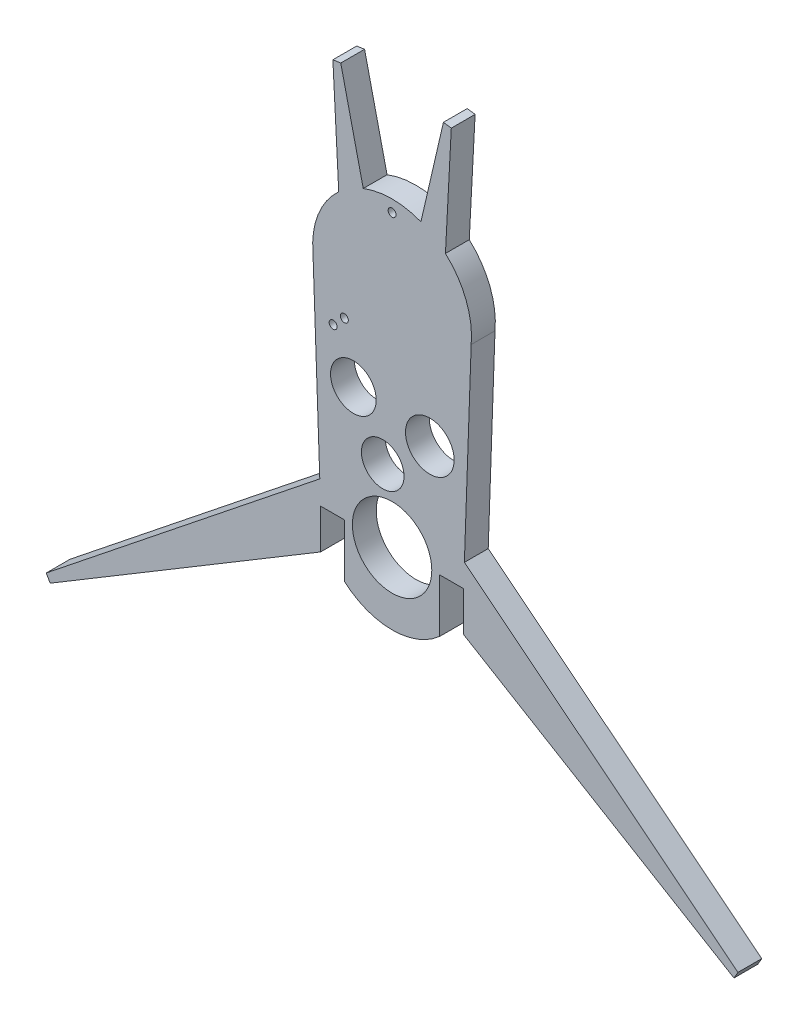
ISO-10303-21;
HEADER;
FILE_DESCRIPTION(('STEP AP214'),'2;1');
FILE_NAME('part.step','',(''),(''),'','','');
FILE_SCHEMA(('AUTOMOTIVE_DESIGN { 1 0 10303 214 1 1 1 1 }'));
ENDSEC;
DATA;
#1=APPLICATION_CONTEXT('core data for automotive mechanical design processes');
#2=APPLICATION_PROTOCOL_DEFINITION('international standard','automotive_design',2000,#1);
#3=PRODUCT_CONTEXT('',#1,'mechanical');
#4=PRODUCT('Part','Part','',(#3));
#5=PRODUCT_RELATED_PRODUCT_CATEGORY('part','',(#4));
#6=PRODUCT_DEFINITION_FORMATION('','',#4);
#7=PRODUCT_DEFINITION_CONTEXT('part definition',#1,'design');
#8=PRODUCT_DEFINITION('design','',#6,#7);
#9=PRODUCT_DEFINITION_SHAPE('','',#8);
#10=(LENGTH_UNIT() NAMED_UNIT(*) SI_UNIT(.MILLI.,.METRE.));
#11=(NAMED_UNIT(*) PLANE_ANGLE_UNIT() SI_UNIT($,.RADIAN.));
#12=(NAMED_UNIT(*) SI_UNIT($,.STERADIAN.) SOLID_ANGLE_UNIT());
#13=UNCERTAINTY_MEASURE_WITH_UNIT(LENGTH_MEASURE(1.E-05),#10,'distance_accuracy_value','');
#14=(GEOMETRIC_REPRESENTATION_CONTEXT(3) GLOBAL_UNCERTAINTY_ASSIGNED_CONTEXT((#13)) GLOBAL_UNIT_ASSIGNED_CONTEXT((#10,
#11,#12)) REPRESENTATION_CONTEXT('',''));
#15=CARTESIAN_POINT('',(0.,0.,0.));
#16=DIRECTION('',(0.,0.,1.));
#17=DIRECTION('',(1.,0.,0.));
#18=AXIS2_PLACEMENT_3D('',#15,#16,#17);
#19=CARTESIAN_POINT('',(0.,28.,3.));
#20=DIRECTION('',(0.,0.,-1.));
#21=DIRECTION('',(-1.,0.,0.));
#22=AXIS2_PLACEMENT_3D('',#19,#20,#21);
#23=CYLINDRICAL_SURFACE('',#22,10.);
#24=CARTESIAN_POINT('',(0.,28.,0.));
#25=DIRECTION('',(0.,0.,1.));
#26=DIRECTION('',(-1.,0.,0.));
#27=AXIS2_PLACEMENT_3D('',#24,#25,#26);
#28=CIRCLE('',#27,10.);
#29=CARTESIAN_POINT('',(3.63174307168968,37.3172121507044,0.));
#30=VERTEX_POINT('',#29);
#31=CARTESIAN_POINT('',(-3.63174307168968,37.3172121507044,0.));
#32=VERTEX_POINT('',#31);
#33=EDGE_CURVE('E220',#30,#32,#28,.T.);
#34=ORIENTED_EDGE('',*,*,#33,.T.);
#35=DIRECTION('',(0.,0.,1.));
#36=VECTOR('',#35,1.);
#37=CARTESIAN_POINT('',(-3.63174307168968,37.3172121507044,0.));
#38=LINE('',#37,#36);
#39=CARTESIAN_POINT('',(-3.63174307168968,37.3172121507044,3.));
#40=VERTEX_POINT('',#39);
#41=EDGE_CURVE('E207',#32,#40,#38,.T.);
#42=ORIENTED_EDGE('',*,*,#41,.T.);
#43=CARTESIAN_POINT('',(0.,28.,3.));
#44=DIRECTION('',(0.,0.,1.));
#45=DIRECTION('',(-1.,0.,0.));
#46=AXIS2_PLACEMENT_3D('',#43,#44,#45);
#47=CIRCLE('',#46,10.);
#48=CARTESIAN_POINT('',(3.63174307168965,37.3172121507044,3.));
#49=VERTEX_POINT('',#48);
#50=EDGE_CURVE('E218',#49,#40,#47,.T.);
#51=ORIENTED_EDGE('',*,*,#50,.F.);
#52=DIRECTION('',(0.,0.,1.));
#53=VECTOR('',#52,1.);
#54=CARTESIAN_POINT('',(3.63174307168968,37.3172121507044,0.));
#55=LINE('',#54,#53);
#56=EDGE_CURVE('E211',#30,#49,#55,.T.);
#57=ORIENTED_EDGE('',*,*,#56,.F.);
#58=EDGE_LOOP('',(#34,#42,#51,#57));
#59=FACE_BOUND('',#58,.T.);
#60=ADVANCED_FACE('F41',(#59),#23,.T.);
#61=CARTESIAN_POINT('',(-6.71816014535384,35.4071805878741,3.));
#62=VERTEX_POINT('',#61);
#63=CARTESIAN_POINT('',(-9.95907170702906,27.0961799215256,3.));
#64=VERTEX_POINT('',#63);
#65=EDGE_CURVE('E226',#62,#64,#47,.T.);
#66=ORIENTED_EDGE('',*,*,#65,.F.);
#67=DIRECTION('',(0.,0.,1.));
#68=VECTOR('',#67,1.);
#69=CARTESIAN_POINT('',(-6.71816014535384,35.4071805878741,0.));
#70=LINE('',#69,#68);
#71=CARTESIAN_POINT('',(-6.71816014535384,35.4071805878741,0.));
#72=VERTEX_POINT('',#71);
#73=EDGE_CURVE('E221',#72,#62,#70,.T.);
#74=ORIENTED_EDGE('',*,*,#73,.F.);
#75=CARTESIAN_POINT('',(-9.95907170702906,27.0961799215256,0.));
#76=VERTEX_POINT('',#75);
#77=EDGE_CURVE('E255',#72,#76,#28,.T.);
#78=ORIENTED_EDGE('',*,*,#77,.T.);
#79=DIRECTION('',(0.,0.,-1.));
#80=VECTOR('',#79,1.);
#81=CARTESIAN_POINT('',(-9.95907170702906,27.0961799215256,3.));
#82=LINE('',#81,#80);
#83=EDGE_CURVE('E289',#64,#76,#82,.T.);
#84=ORIENTED_EDGE('',*,*,#83,.F.);
#85=EDGE_LOOP('',(#66,#74,#78,#84));
#86=FACE_BOUND('',#85,.T.);
#87=ADVANCED_FACE('F399',(#86),#23,.T.);
#88=CARTESIAN_POINT('',(0.,28.,3.));
#89=DIRECTION('',(0.,0.,-1.));
#90=DIRECTION('',(-1.,0.,0.));
#91=AXIS2_PLACEMENT_3D('',#88,#89,#90);
#92=PLANE('',#91);
#93=ORIENTED_EDGE('',*,*,#50,.T.);
#94=DIRECTION('',(-0.224951054343858,0.974370064785237,0.));
#95=VECTOR('',#94,1.);
#96=CARTESIAN_POINT('',(-3.63174307168968,37.3172121507044,3.));
#97=LINE('',#96,#95);
#98=CARTESIAN_POINT('',(-6.46352101363214,49.5829899875586,3.));
#99=VERTEX_POINT('',#98);
#100=EDGE_CURVE('E203',#40,#99,#97,.T.);
#101=ORIENTED_EDGE('',*,*,#100,.T.);
#102=DIRECTION('',(-0.990268068741571,-0.139173100960059,0.));
#103=VECTOR('',#102,1.);
#104=CARTESIAN_POINT('',(-6.46352101363214,49.5829899875586,3.));
#105=LINE('',#104,#103);
#106=CARTESIAN_POINT('',(-7.45378908237371,49.4438168865985,3.));
#107=VERTEX_POINT('',#106);
#108=EDGE_CURVE('E212',#99,#107,#105,.T.);
#109=ORIENTED_EDGE('',*,*,#108,.T.);
#110=DIRECTION('',(0.0523359562429436,-0.998629534754574,0.));
#111=VECTOR('',#110,1.);
#112=CARTESIAN_POINT('',(-7.45378908237371,49.4438168865985,3.));
#113=LINE('',#112,#111);
#114=EDGE_CURVE('E56',#107,#62,#113,.T.);
#115=ORIENTED_EDGE('',*,*,#114,.T.);
#116=ORIENTED_EDGE('',*,*,#65,.T.);
#117=DIRECTION('',(0.0353729383723889,-0.999374181791236,0.));
#118=VECTOR('',#117,1.);
#119=CARTESIAN_POINT('',(-9.,0.,3.));
#120=LINE('',#119,#118);
#121=CARTESIAN_POINT('',(-9.1032688798853,2.91760473086458,3.));
#122=VERTEX_POINT('',#121);
#123=EDGE_CURVE('E229',#64,#122,#120,.T.);
#124=ORIENTED_EDGE('',*,*,#123,.T.);
#125=DIRECTION('',(-0.781679862279824,-0.623679880151826,0.));
#126=VECTOR('',#125,1.);
#127=CARTESIAN_POINT('',(-43.5491050715832,-24.5657372668561,3.));
#128=LINE('',#127,#126);
#129=CARTESIAN_POINT('',(-43.5491050715832,-24.5657372668561,3.));
#130=VERTEX_POINT('',#129);
#131=EDGE_CURVE('E461',#122,#130,#128,.T.);
#132=ORIENTED_EDGE('',*,*,#131,.T.);
#133=DIRECTION('',(0.499999999999997,-0.86602540378444,0.));
#134=VECTOR('',#133,1.);
#135=CARTESIAN_POINT('',(-43.0491050715832,-25.4317626706406,3.));
#136=LINE('',#135,#134);
#137=CARTESIAN_POINT('',(-43.0491050715832,-25.4317626706406,3.));
#138=VERTEX_POINT('',#137);
#139=EDGE_CURVE('E465',#130,#138,#136,.T.);
#140=ORIENTED_EDGE('',*,*,#139,.T.);
#141=DIRECTION('',(0.857467375192334,0.514538337231318,0.));
#142=VECTOR('',#141,1.);
#143=CARTESIAN_POINT('',(-9.,-5.,3.));
#144=LINE('',#143,#142);
#145=CARTESIAN_POINT('',(-9.,-5.,3.));
#146=VERTEX_POINT('',#145);
#147=EDGE_CURVE('E459',#138,#146,#144,.T.);
#148=ORIENTED_EDGE('',*,*,#147,.T.);
#149=DIRECTION('',(0.,1.,0.));
#150=VECTOR('',#149,1.);
#151=CARTESIAN_POINT('',(-9.,-5.,3.));
#152=LINE('',#151,#150);
#153=CARTESIAN_POINT('',(-9.,0.,3.));
#154=VERTEX_POINT('',#153);
#155=EDGE_CURVE('E456',#146,#154,#152,.T.);
#156=ORIENTED_EDGE('',*,*,#155,.T.);
#157=DIRECTION('',(1.,0.,0.));
#158=VECTOR('',#157,1.);
#159=CARTESIAN_POINT('',(-6.,0.,3.));
#160=LINE('',#159,#158);
#161=CARTESIAN_POINT('',(-6.,0.,3.));
#162=VERTEX_POINT('',#161);
#163=EDGE_CURVE('E237',#154,#162,#160,.T.);
#164=ORIENTED_EDGE('',*,*,#163,.T.);
#165=DIRECTION('',(0.,-1.,0.));
#166=VECTOR('',#165,1.);
#167=CARTESIAN_POINT('',(-6.,-6.70820393249937,3.));
#168=LINE('',#167,#166);
#169=CARTESIAN_POINT('',(-6.,-6.70820393249937,3.));
#170=VERTEX_POINT('',#169);
#171=EDGE_CURVE('E239',#162,#170,#168,.T.);
#172=ORIENTED_EDGE('',*,*,#171,.T.);
#173=CARTESIAN_POINT('',(0.,0.,3.));
#174=DIRECTION('',(0.,0.,1.));
#175=DIRECTION('',(1.,0.,0.));
#176=AXIS2_PLACEMENT_3D('',#173,#174,#175);
#177=CIRCLE('',#176,9.);
#178=CARTESIAN_POINT('',(6.,-6.70820393249937,3.));
#179=VERTEX_POINT('',#178);
#180=EDGE_CURVE('E241',#170,#179,#177,.T.);
#181=ORIENTED_EDGE('',*,*,#180,.T.);
#182=DIRECTION('',(0.,1.,0.));
#183=VECTOR('',#182,1.);
#184=CARTESIAN_POINT('',(6.,-6.70820393249937,3.));
#185=LINE('',#184,#183);
#186=CARTESIAN_POINT('',(6.,0.,3.));
#187=VERTEX_POINT('',#186);
#188=EDGE_CURVE('E243',#179,#187,#185,.T.);
#189=ORIENTED_EDGE('',*,*,#188,.T.);
#190=DIRECTION('',(1.,0.,0.));
#191=VECTOR('',#190,1.);
#192=CARTESIAN_POINT('',(6.,0.,3.));
#193=LINE('',#192,#191);
#194=CARTESIAN_POINT('',(8.99999999999999,-5.49563307542137E-13,3.));
#195=VERTEX_POINT('',#194);
#196=EDGE_CURVE('E245',#187,#195,#193,.T.);
#197=ORIENTED_EDGE('',*,*,#196,.T.);
#198=DIRECTION('',(0.,-1.,0.));
#199=VECTOR('',#198,1.);
#200=CARTESIAN_POINT('',(9.,-5.,3.));
#201=LINE('',#200,#199);
#202=CARTESIAN_POINT('',(9.,-5.,3.));
#203=VERTEX_POINT('',#202);
#204=EDGE_CURVE('E463',#195,#203,#201,.T.);
#205=ORIENTED_EDGE('',*,*,#204,.T.);
#206=DIRECTION('',(0.857467375192334,-0.514538337231317,0.));
#207=VECTOR('',#206,1.);
#208=CARTESIAN_POINT('',(9.,-5.,3.));
#209=LINE('',#208,#207);
#210=CARTESIAN_POINT('',(43.0491050715832,-25.4317626706405,3.));
#211=VERTEX_POINT('',#210);
#212=EDGE_CURVE('E327',#203,#211,#209,.T.);
#213=ORIENTED_EDGE('',*,*,#212,.T.);
#214=DIRECTION('',(0.499999999999997,0.86602540378444,0.));
#215=VECTOR('',#214,1.);
#216=CARTESIAN_POINT('',(43.0491050715832,-25.4317626706405,3.));
#217=LINE('',#216,#215);
#218=CARTESIAN_POINT('',(43.5491050715832,-24.5657372668561,3.));
#219=VERTEX_POINT('',#218);
#220=EDGE_CURVE('E322',#211,#219,#217,.T.);
#221=ORIENTED_EDGE('',*,*,#220,.T.);
#222=DIRECTION('',(-0.781679862279824,0.623679880151826,0.));
#223=VECTOR('',#222,1.);
#224=CARTESIAN_POINT('',(43.5491050715832,-24.5657372668561,3.));
#225=LINE('',#224,#223);
#226=CARTESIAN_POINT('',(9.1032688798853,2.91760473086458,3.));
#227=VERTEX_POINT('',#226);
#228=EDGE_CURVE('E319',#219,#227,#225,.T.);
#229=ORIENTED_EDGE('',*,*,#228,.T.);
#230=DIRECTION('',(0.0353729383723889,0.999374181791236,0.));
#231=VECTOR('',#230,1.);
#232=CARTESIAN_POINT('',(9.,0.,3.));
#233=LINE('',#232,#231);
#234=CARTESIAN_POINT('',(9.95907170702906,27.0961799215256,3.));
#235=VERTEX_POINT('',#234);
#236=EDGE_CURVE('E248',#227,#235,#233,.T.);
#237=ORIENTED_EDGE('',*,*,#236,.T.);
#238=CARTESIAN_POINT('',(6.71816014535384,35.4071805878741,3.));
#239=VERTEX_POINT('',#238);
#240=EDGE_CURVE('E225',#235,#239,#47,.T.);
#241=ORIENTED_EDGE('',*,*,#240,.T.);
#242=DIRECTION('',(0.0523359562429436,0.998629534754574,0.));
#243=VECTOR('',#242,1.);
#244=CARTESIAN_POINT('',(7.45378908237371,49.4438168865985,3.));
#245=LINE('',#244,#243);
#246=CARTESIAN_POINT('',(7.45378908237371,49.4438168865985,3.));
#247=VERTEX_POINT('',#246);
#248=EDGE_CURVE('E317',#239,#247,#245,.T.);
#249=ORIENTED_EDGE('',*,*,#248,.T.);
#250=DIRECTION('',(-0.990268068741571,0.139173100960059,0.));
#251=VECTOR('',#250,1.);
#252=CARTESIAN_POINT('',(6.46352101363214,49.5829899875586,3.));
#253=LINE('',#252,#251);
#254=CARTESIAN_POINT('',(6.46352101363214,49.5829899875586,3.));
#255=VERTEX_POINT('',#254);
#256=EDGE_CURVE('E758',#247,#255,#253,.T.);
#257=ORIENTED_EDGE('',*,*,#256,.T.);
#258=DIRECTION('',(-0.224951054343858,-0.974370064785237,0.));
#259=VECTOR('',#258,1.);
#260=CARTESIAN_POINT('',(3.63174307168968,37.3172121507044,3.));
#261=LINE('',#260,#259);
#262=EDGE_CURVE('E63',#255,#49,#261,.T.);
#263=ORIENTED_EDGE('',*,*,#262,.T.);
#264=EDGE_LOOP('',(#93,#101,#109,#115,#116,#124,#132,#140,#148,#156,#164,#172,#181,#189,#197,
#205,#213,#221,#229,#237,#241,#249,#257,#263));
#265=FACE_BOUND('',#264,.T.);
#266=CARTESIAN_POINT('',(0.,0.,3.));
#267=DIRECTION('',(0.,0.,1.));
#268=DIRECTION('',(1.,0.,0.));
#269=AXIS2_PLACEMENT_3D('',#266,#267,#268);
#270=CIRCLE('',#269,5.);
#271=CARTESIAN_POINT('',(5.,0.,3.));
#272=VERTEX_POINT('',#271);
#273=EDGE_CURVE('E373',#272,#272,#270,.T.);
#274=ORIENTED_EDGE('',*,*,#273,.F.);
#275=EDGE_LOOP('',(#274));
#276=FACE_BOUND('',#275,.T.);
#277=CARTESIAN_POINT('',(-4.87423041916293,15.0480677752898,3.));
#278=DIRECTION('',(0.,0.,1.));
#279=DIRECTION('',(1.,0.,0.));
#280=AXIS2_PLACEMENT_3D('',#277,#278,#279);
#281=CIRCLE('',#280,2.87750647764229);
#282=CARTESIAN_POINT('',(-1.99672394152064,15.0480677752898,3.));
#283=VERTEX_POINT('',#282);
#284=EDGE_CURVE('E369',#283,#283,#281,.T.);
#285=ORIENTED_EDGE('',*,*,#284,.F.);
#286=EDGE_LOOP('',(#285));
#287=FACE_BOUND('',#286,.T.);
#288=CARTESIAN_POINT('',(4.75073652574446,13.4161529645615,3.));
#289=DIRECTION('',(0.,0.,1.));
#290=DIRECTION('',(1.,0.,0.));
#291=AXIS2_PLACEMENT_3D('',#288,#289,#290);
#292=CIRCLE('',#291,3.0634845054764);
#293=CARTESIAN_POINT('',(7.81422103122086,13.4161529645615,3.));
#294=VERTEX_POINT('',#293);
#295=EDGE_CURVE('E363',#294,#294,#292,.T.);
#296=ORIENTED_EDGE('',*,*,#295,.F.);
#297=EDGE_LOOP('',(#296));
#298=FACE_BOUND('',#297,.T.);
#299=CARTESIAN_POINT('',(-1.17744380710507,8.48710414848437,3.));
#300=DIRECTION('',(0.,0.,1.));
#301=DIRECTION('',(1.,0.,0.));
#302=AXIS2_PLACEMENT_3D('',#299,#300,#301);
#303=CIRCLE('',#302,2.6843256323907);
#304=CARTESIAN_POINT('',(1.50688182528563,8.48710414848437,3.));
#305=VERTEX_POINT('',#304);
#306=EDGE_CURVE('E357',#305,#305,#303,.T.);
#307=ORIENTED_EDGE('',*,*,#306,.F.);
#308=EDGE_LOOP('',(#307));
#309=FACE_BOUND('',#308,.T.);
#310=CARTESIAN_POINT('',(-6.01040764008566,21.9895923599144,3.));
#311=DIRECTION('',(0.,0.,1.));
#312=DIRECTION('',(1.,0.,0.));
#313=AXIS2_PLACEMENT_3D('',#310,#311,#312);
#314=CIRCLE('',#313,0.500000000000002);
#315=CARTESIAN_POINT('',(-5.51040764008566,21.9895923599144,3.));
#316=VERTEX_POINT('',#315);
#317=EDGE_CURVE('E351',#316,#316,#314,.T.);
#318=ORIENTED_EDGE('',*,*,#317,.F.);
#319=EDGE_LOOP('',(#318));
#320=FACE_BOUND('',#319,.T.);
#321=CARTESIAN_POINT('',(-7.42462120245876,20.5753787975413,3.));
#322=DIRECTION('',(0.,0.,1.));
#323=DIRECTION('',(1.,0.,0.));
#324=AXIS2_PLACEMENT_3D('',#321,#322,#323);
#325=CIRCLE('',#324,0.500000000000002);
#326=CARTESIAN_POINT('',(-6.92462120245876,20.5753787975413,3.));
#327=VERTEX_POINT('',#326);
#328=EDGE_CURVE('E345',#327,#327,#325,.T.);
#329=ORIENTED_EDGE('',*,*,#328,.F.);
#330=EDGE_LOOP('',(#329));
#331=FACE_BOUND('',#330,.T.);
#332=CARTESIAN_POINT('',(0.,36.5,3.));
#333=DIRECTION('',(0.,0.,1.));
#334=DIRECTION('',(1.,0.,0.));
#335=AXIS2_PLACEMENT_3D('',#332,#333,#334);
#336=CIRCLE('',#335,0.5);
#337=CARTESIAN_POINT('',(0.5,36.5,3.));
#338=VERTEX_POINT('',#337);
#339=EDGE_CURVE('E339',#338,#338,#336,.T.);
#340=ORIENTED_EDGE('',*,*,#339,.F.);
#341=EDGE_LOOP('',(#340));
#342=FACE_BOUND('',#341,.T.);
#343=ADVANCED_FACE('F223',(#265,#276,#287,#298,#309,#320,#331,#342),#92,.F.);
#344=CARTESIAN_POINT('',(0.,28.,0.));
#345=DIRECTION('',(0.,0.,-1.));
#346=DIRECTION('',(-1.,0.,0.));
#347=AXIS2_PLACEMENT_3D('',#344,#345,#346);
#348=PLANE('',#347);
#349=ORIENTED_EDGE('',*,*,#77,.F.);
#350=DIRECTION('',(0.0523359562429436,-0.998629534754574,0.));
#351=VECTOR('',#350,1.);
#352=CARTESIAN_POINT('',(-7.45378908237371,49.4438168865985,0.));
#353=LINE('',#352,#351);
#354=CARTESIAN_POINT('',(-7.45378908237371,49.4438168865985,0.));
#355=VERTEX_POINT('',#354);
#356=EDGE_CURVE('E745',#355,#72,#353,.T.);
#357=ORIENTED_EDGE('',*,*,#356,.F.);
#358=DIRECTION('',(-0.990268068741571,-0.139173100960059,0.));
#359=VECTOR('',#358,1.);
#360=CARTESIAN_POINT('',(-6.46352101363214,49.5829899875586,0.));
#361=LINE('',#360,#359);
#362=CARTESIAN_POINT('',(-6.46352101363214,49.5829899875586,0.));
#363=VERTEX_POINT('',#362);
#364=EDGE_CURVE('E747',#363,#355,#361,.T.);
#365=ORIENTED_EDGE('',*,*,#364,.F.);
#366=DIRECTION('',(-0.224951054343858,0.974370064785237,0.));
#367=VECTOR('',#366,1.);
#368=CARTESIAN_POINT('',(-3.63174307168968,37.3172121507044,0.));
#369=LINE('',#368,#367);
#370=EDGE_CURVE('E742',#32,#363,#369,.T.);
#371=ORIENTED_EDGE('',*,*,#370,.F.);
#372=ORIENTED_EDGE('',*,*,#33,.F.);
#373=DIRECTION('',(-0.224951054343858,-0.974370064785237,0.));
#374=VECTOR('',#373,1.);
#375=CARTESIAN_POINT('',(3.63174307168968,37.3172121507044,0.));
#376=LINE('',#375,#374);
#377=CARTESIAN_POINT('',(6.46352101363214,49.5829899875586,0.));
#378=VERTEX_POINT('',#377);
#379=EDGE_CURVE('E751',#378,#30,#376,.T.);
#380=ORIENTED_EDGE('',*,*,#379,.F.);
#381=DIRECTION('',(-0.990268068741571,0.139173100960059,0.));
#382=VECTOR('',#381,1.);
#383=CARTESIAN_POINT('',(6.46352101363214,49.5829899875586,0.));
#384=LINE('',#383,#382);
#385=CARTESIAN_POINT('',(7.45378908237371,49.4438168865985,0.));
#386=VERTEX_POINT('',#385);
#387=EDGE_CURVE('E763',#386,#378,#384,.T.);
#388=ORIENTED_EDGE('',*,*,#387,.F.);
#389=DIRECTION('',(0.0523359562429436,0.998629534754574,0.));
#390=VECTOR('',#389,1.);
#391=CARTESIAN_POINT('',(7.45378908237371,49.4438168865985,0.));
#392=LINE('',#391,#390);
#393=CARTESIAN_POINT('',(6.71816014535384,35.4071805878741,0.));
#394=VERTEX_POINT('',#393);
#395=EDGE_CURVE('E311',#394,#386,#392,.T.);
#396=ORIENTED_EDGE('',*,*,#395,.F.);
#397=CARTESIAN_POINT('',(9.95907170702906,27.0961799215256,0.));
#398=VERTEX_POINT('',#397);
#399=EDGE_CURVE('E251',#398,#394,#28,.T.);
#400=ORIENTED_EDGE('',*,*,#399,.F.);
#401=DIRECTION('',(0.0353729383723889,0.999374181791236,0.));
#402=VECTOR('',#401,1.);
#403=CARTESIAN_POINT('',(9.,0.,0.));
#404=LINE('',#403,#402);
#405=CARTESIAN_POINT('',(9.1032688798853,2.91760473086458,0.));
#406=VERTEX_POINT('',#405);
#407=EDGE_CURVE('E230',#406,#398,#404,.T.);
#408=ORIENTED_EDGE('',*,*,#407,.F.);
#409=DIRECTION('',(-0.781679862279824,0.623679880151826,0.));
#410=VECTOR('',#409,1.);
#411=CARTESIAN_POINT('',(43.5491050715832,-24.5657372668561,0.));
#412=LINE('',#411,#410);
#413=CARTESIAN_POINT('',(43.5491050715832,-24.5657372668561,0.));
#414=VERTEX_POINT('',#413);
#415=EDGE_CURVE('E307',#414,#406,#412,.T.);
#416=ORIENTED_EDGE('',*,*,#415,.F.);
#417=DIRECTION('',(0.499999999999997,0.86602540378444,0.));
#418=VECTOR('',#417,1.);
#419=CARTESIAN_POINT('',(43.0491050715832,-25.4317626706405,0.));
#420=LINE('',#419,#418);
#421=CARTESIAN_POINT('',(43.0491050715832,-25.4317626706405,0.));
#422=VERTEX_POINT('',#421);
#423=EDGE_CURVE('E482',#422,#414,#420,.T.);
#424=ORIENTED_EDGE('',*,*,#423,.F.);
#425=DIRECTION('',(0.857467375192334,-0.514538337231317,0.));
#426=VECTOR('',#425,1.);
#427=CARTESIAN_POINT('',(9.,-5.,0.));
#428=LINE('',#427,#426);
#429=CARTESIAN_POINT('',(9.,-5.,0.));
#430=VERTEX_POINT('',#429);
#431=EDGE_CURVE('E325',#430,#422,#428,.T.);
#432=ORIENTED_EDGE('',*,*,#431,.F.);
#433=DIRECTION('',(0.,-1.,0.));
#434=VECTOR('',#433,1.);
#435=CARTESIAN_POINT('',(9.,-5.,0.));
#436=LINE('',#435,#434);
#437=CARTESIAN_POINT('',(8.99999999999999,-5.49563307542137E-13,0.));
#438=VERTEX_POINT('',#437);
#439=EDGE_CURVE('E323',#438,#430,#436,.T.);
#440=ORIENTED_EDGE('',*,*,#439,.F.);
#441=DIRECTION('',(1.,0.,0.));
#442=VECTOR('',#441,1.);
#443=CARTESIAN_POINT('',(6.,0.,0.));
#444=LINE('',#443,#442);
#445=CARTESIAN_POINT('',(6.,0.,0.));
#446=VERTEX_POINT('',#445);
#447=EDGE_CURVE('E266',#446,#438,#444,.T.);
#448=ORIENTED_EDGE('',*,*,#447,.F.);
#449=DIRECTION('',(0.,1.,0.));
#450=VECTOR('',#449,1.);
#451=CARTESIAN_POINT('',(6.,-6.70820393249937,0.));
#452=LINE('',#451,#450);
#453=CARTESIAN_POINT('',(6.,-6.70820393249937,0.));
#454=VERTEX_POINT('',#453);
#455=EDGE_CURVE('E264',#454,#446,#452,.T.);
#456=ORIENTED_EDGE('',*,*,#455,.F.);
#457=CARTESIAN_POINT('',(0.,0.,0.));
#458=DIRECTION('',(0.,0.,1.));
#459=DIRECTION('',(1.,0.,0.));
#460=AXIS2_PLACEMENT_3D('',#457,#458,#459);
#461=CIRCLE('',#460,9.);
#462=CARTESIAN_POINT('',(-6.,-6.70820393249937,0.));
#463=VERTEX_POINT('',#462);
#464=EDGE_CURVE('E262',#463,#454,#461,.T.);
#465=ORIENTED_EDGE('',*,*,#464,.F.);
#466=DIRECTION('',(0.,-1.,0.));
#467=VECTOR('',#466,1.);
#468=CARTESIAN_POINT('',(-6.,-6.70820393249937,0.));
#469=LINE('',#468,#467);
#470=CARTESIAN_POINT('',(-6.,0.,0.));
#471=VERTEX_POINT('',#470);
#472=EDGE_CURVE('E260',#471,#463,#469,.T.);
#473=ORIENTED_EDGE('',*,*,#472,.F.);
#474=DIRECTION('',(1.,0.,0.));
#475=VECTOR('',#474,1.);
#476=CARTESIAN_POINT('',(-6.,0.,0.));
#477=LINE('',#476,#475);
#478=CARTESIAN_POINT('',(-9.,0.,0.));
#479=VERTEX_POINT('',#478);
#480=EDGE_CURVE('E258',#479,#471,#477,.T.);
#481=ORIENTED_EDGE('',*,*,#480,.F.);
#482=DIRECTION('',(0.,1.,0.));
#483=VECTOR('',#482,1.);
#484=CARTESIAN_POINT('',(-9.,-5.,0.));
#485=LINE('',#484,#483);
#486=CARTESIAN_POINT('',(-9.,-5.,0.));
#487=VERTEX_POINT('',#486);
#488=EDGE_CURVE('E475',#487,#479,#485,.T.);
#489=ORIENTED_EDGE('',*,*,#488,.F.);
#490=DIRECTION('',(0.857467375192334,0.514538337231318,0.));
#491=VECTOR('',#490,1.);
#492=CARTESIAN_POINT('',(-9.,-5.,0.));
#493=LINE('',#492,#491);
#494=CARTESIAN_POINT('',(-43.0491050715832,-25.4317626706406,0.));
#495=VERTEX_POINT('',#494);
#496=EDGE_CURVE('E477',#495,#487,#493,.T.);
#497=ORIENTED_EDGE('',*,*,#496,.F.);
#498=DIRECTION('',(0.499999999999997,-0.86602540378444,0.));
#499=VECTOR('',#498,1.);
#500=CARTESIAN_POINT('',(-43.0491050715832,-25.4317626706406,0.));
#501=LINE('',#500,#499);
#502=CARTESIAN_POINT('',(-43.5491050715832,-24.5657372668561,0.));
#503=VERTEX_POINT('',#502);
#504=EDGE_CURVE('E469',#503,#495,#501,.T.);
#505=ORIENTED_EDGE('',*,*,#504,.F.);
#506=DIRECTION('',(-0.781679862279824,-0.623679880151826,0.));
#507=VECTOR('',#506,1.);
#508=CARTESIAN_POINT('',(-43.5491050715832,-24.5657372668561,0.));
#509=LINE('',#508,#507);
#510=CARTESIAN_POINT('',(-9.1032688798853,2.91760473086458,0.));
#511=VERTEX_POINT('',#510);
#512=EDGE_CURVE('E472',#511,#503,#509,.T.);
#513=ORIENTED_EDGE('',*,*,#512,.F.);
#514=DIRECTION('',(0.0353729383723889,-0.999374181791236,0.));
#515=VECTOR('',#514,1.);
#516=CARTESIAN_POINT('',(-9.,0.,0.));
#517=LINE('',#516,#515);
#518=EDGE_CURVE('E254',#76,#511,#517,.T.);
#519=ORIENTED_EDGE('',*,*,#518,.F.);
#520=EDGE_LOOP('',(#349,#357,#365,#371,#372,#380,#388,#396,#400,#408,#416,#424,#432,#440,#448,
#456,#465,#473,#481,#489,#497,#505,#513,#519));
#521=FACE_BOUND('',#520,.T.);
#522=CARTESIAN_POINT('',(-7.42462120245876,20.5753787975413,0.));
#523=DIRECTION('',(0.,0.,1.));
#524=DIRECTION('',(1.,0.,0.));
#525=AXIS2_PLACEMENT_3D('',#522,#523,#524);
#526=CIRCLE('',#525,0.500000000000002);
#527=CARTESIAN_POINT('',(-6.92462120245876,20.5753787975413,0.));
#528=VERTEX_POINT('',#527);
#529=EDGE_CURVE('E342',#528,#528,#526,.T.);
#530=ORIENTED_EDGE('',*,*,#529,.T.);
#531=EDGE_LOOP('',(#530));
#532=FACE_BOUND('',#531,.T.);
#533=CARTESIAN_POINT('',(-1.17744380710507,8.48710414848437,0.));
#534=DIRECTION('',(0.,0.,1.));
#535=DIRECTION('',(1.,0.,0.));
#536=AXIS2_PLACEMENT_3D('',#533,#534,#535);
#537=CIRCLE('',#536,2.6843256323907);
#538=CARTESIAN_POINT('',(1.50688182528563,8.48710414848437,0.));
#539=VERTEX_POINT('',#538);
#540=EDGE_CURVE('E354',#539,#539,#537,.T.);
#541=ORIENTED_EDGE('',*,*,#540,.T.);
#542=EDGE_LOOP('',(#541));
#543=FACE_BOUND('',#542,.T.);
#544=CARTESIAN_POINT('',(-4.87423041916293,15.0480677752898,0.));
#545=DIRECTION('',(0.,0.,1.));
#546=DIRECTION('',(1.,0.,0.));
#547=AXIS2_PLACEMENT_3D('',#544,#545,#546);
#548=CIRCLE('',#547,2.87750647764229);
#549=CARTESIAN_POINT('',(-1.99672394152064,15.0480677752898,0.));
#550=VERTEX_POINT('',#549);
#551=EDGE_CURVE('E366',#550,#550,#548,.T.);
#552=ORIENTED_EDGE('',*,*,#551,.T.);
#553=EDGE_LOOP('',(#552));
#554=FACE_BOUND('',#553,.T.);
#555=CARTESIAN_POINT('',(0.,0.,0.));
#556=DIRECTION('',(0.,0.,1.));
#557=DIRECTION('',(1.,0.,0.));
#558=AXIS2_PLACEMENT_3D('',#555,#556,#557);
#559=CIRCLE('',#558,5.);
#560=CARTESIAN_POINT('',(5.,0.,0.));
#561=VERTEX_POINT('',#560);
#562=EDGE_CURVE('E233',#561,#561,#559,.T.);
#563=ORIENTED_EDGE('',*,*,#562,.T.);
#564=EDGE_LOOP('',(#563));
#565=FACE_BOUND('',#564,.T.);
#566=CARTESIAN_POINT('',(4.75073652574446,13.4161529645615,0.));
#567=DIRECTION('',(0.,0.,1.));
#568=DIRECTION('',(1.,0.,0.));
#569=AXIS2_PLACEMENT_3D('',#566,#567,#568);
#570=CIRCLE('',#569,3.0634845054764);
#571=CARTESIAN_POINT('',(7.81422103122086,13.4161529645615,0.));
#572=VERTEX_POINT('',#571);
#573=EDGE_CURVE('E360',#572,#572,#570,.T.);
#574=ORIENTED_EDGE('',*,*,#573,.T.);
#575=EDGE_LOOP('',(#574));
#576=FACE_BOUND('',#575,.T.);
#577=CARTESIAN_POINT('',(-6.01040764008566,21.9895923599144,0.));
#578=DIRECTION('',(0.,0.,1.));
#579=DIRECTION('',(1.,0.,0.));
#580=AXIS2_PLACEMENT_3D('',#577,#578,#579);
#581=CIRCLE('',#580,0.500000000000002);
#582=CARTESIAN_POINT('',(-5.51040764008566,21.9895923599144,0.));
#583=VERTEX_POINT('',#582);
#584=EDGE_CURVE('E348',#583,#583,#581,.T.);
#585=ORIENTED_EDGE('',*,*,#584,.T.);
#586=EDGE_LOOP('',(#585));
#587=FACE_BOUND('',#586,.T.);
#588=CARTESIAN_POINT('',(0.,36.5,0.));
#589=DIRECTION('',(0.,0.,1.));
#590=DIRECTION('',(1.,0.,0.));
#591=AXIS2_PLACEMENT_3D('',#588,#589,#590);
#592=CIRCLE('',#591,0.5);
#593=CARTESIAN_POINT('',(0.5,36.5,0.));
#594=VERTEX_POINT('',#593);
#595=EDGE_CURVE('E333',#594,#594,#592,.T.);
#596=ORIENTED_EDGE('',*,*,#595,.T.);
#597=EDGE_LOOP('',(#596));
#598=FACE_BOUND('',#597,.T.);
#599=ADVANCED_FACE('F304',(#521,#532,#543,#554,#565,#576,#587,#598),#348,.T.);
#600=ORIENTED_EDGE('',*,*,#399,.T.);
#601=DIRECTION('',(0.,0.,1.));
#602=VECTOR('',#601,1.);
#603=CARTESIAN_POINT('',(6.71816014535384,35.4071805878741,0.));
#604=LINE('',#603,#602);
#605=EDGE_CURVE('E315',#394,#239,#604,.T.);
#606=ORIENTED_EDGE('',*,*,#605,.T.);
#607=ORIENTED_EDGE('',*,*,#240,.F.);
#608=DIRECTION('',(0.,0.,-1.));
#609=VECTOR('',#608,1.);
#610=CARTESIAN_POINT('',(9.95907170702906,27.0961799215256,3.));
#611=LINE('',#610,#609);
#612=EDGE_CURVE('E250',#235,#398,#611,.T.);
#613=ORIENTED_EDGE('',*,*,#612,.T.);
#614=EDGE_LOOP('',(#600,#606,#607,#613));
#615=FACE_BOUND('',#614,.T.);
#616=ADVANCED_FACE('F43',(#615),#23,.T.);
#617=CARTESIAN_POINT('',(-9.,0.,3.));
#618=DIRECTION('',(0.999374181791236,0.0353729383723889,0.));
#619=DIRECTION('',(-0.0353729383723889,0.999374181791236,0.));
#620=AXIS2_PLACEMENT_3D('',#617,#618,#619);
#621=PLANE('',#620);
#622=ORIENTED_EDGE('',*,*,#518,.T.);
#623=DIRECTION('',(0.,0.,1.));
#624=VECTOR('',#623,1.);
#625=CARTESIAN_POINT('',(-9.1032688798853,2.91760473086459,3.));
#626=LINE('',#625,#624);
#627=EDGE_CURVE('E11',#511,#122,#626,.T.);
#628=ORIENTED_EDGE('',*,*,#627,.T.);
#629=ORIENTED_EDGE('',*,*,#123,.F.);
#630=ORIENTED_EDGE('',*,*,#83,.T.);
#631=EDGE_LOOP('',(#622,#628,#629,#630));
#632=FACE_BOUND('',#631,.T.);
#633=ADVANCED_FACE('F406',(#632),#621,.F.);
#634=CARTESIAN_POINT('',(-6.,0.,3.));
#635=DIRECTION('',(0.,1.,0.));
#636=DIRECTION('',(0.,0.,1.));
#637=AXIS2_PLACEMENT_3D('',#634,#635,#636);
#638=PLANE('',#637);
#639=ORIENTED_EDGE('',*,*,#480,.T.);
#640=DIRECTION('',(0.,0.,-1.));
#641=VECTOR('',#640,1.);
#642=CARTESIAN_POINT('',(-6.,0.,3.));
#643=LINE('',#642,#641);
#644=EDGE_CURVE('E283',#162,#471,#643,.T.);
#645=ORIENTED_EDGE('',*,*,#644,.F.);
#646=ORIENTED_EDGE('',*,*,#163,.F.);
#647=DIRECTION('',(0.,0.,-1.));
#648=VECTOR('',#647,1.);
#649=CARTESIAN_POINT('',(-9.,0.,3.));
#650=LINE('',#649,#648);
#651=EDGE_CURVE('E286',#154,#479,#650,.T.);
#652=ORIENTED_EDGE('',*,*,#651,.T.);
#653=EDGE_LOOP('',(#639,#645,#646,#652));
#654=FACE_BOUND('',#653,.T.);
#655=ADVANCED_FACE('F411',(#654),#638,.F.);
#656=CARTESIAN_POINT('',(-6.,-6.70820393249937,3.));
#657=DIRECTION('',(1.,0.,0.));
#658=DIRECTION('',(0.,0.,-1.));
#659=AXIS2_PLACEMENT_3D('',#656,#657,#658);
#660=PLANE('',#659);
#661=ORIENTED_EDGE('',*,*,#472,.T.);
#662=DIRECTION('',(0.,0.,-1.));
#663=VECTOR('',#662,1.);
#664=CARTESIAN_POINT('',(-6.,-6.70820393249937,3.));
#665=LINE('',#664,#663);
#666=EDGE_CURVE('E280',#170,#463,#665,.T.);
#667=ORIENTED_EDGE('',*,*,#666,.F.);
#668=ORIENTED_EDGE('',*,*,#171,.F.);
#669=ORIENTED_EDGE('',*,*,#644,.T.);
#670=EDGE_LOOP('',(#661,#667,#668,#669));
#671=FACE_BOUND('',#670,.T.);
#672=ADVANCED_FACE('F428',(#671),#660,.F.);
#673=CARTESIAN_POINT('',(0.,0.,3.));
#674=DIRECTION('',(0.,0.,-1.));
#675=DIRECTION('',(-1.,0.,0.));
#676=AXIS2_PLACEMENT_3D('',#673,#674,#675);
#677=CYLINDRICAL_SURFACE('',#676,9.);
#678=ORIENTED_EDGE('',*,*,#464,.T.);
#679=DIRECTION('',(0.,0.,-1.));
#680=VECTOR('',#679,1.);
#681=CARTESIAN_POINT('',(6.,-6.70820393249937,3.));
#682=LINE('',#681,#680);
#683=EDGE_CURVE('E277',#179,#454,#682,.T.);
#684=ORIENTED_EDGE('',*,*,#683,.F.);
#685=ORIENTED_EDGE('',*,*,#180,.F.);
#686=ORIENTED_EDGE('',*,*,#666,.T.);
#687=EDGE_LOOP('',(#678,#684,#685,#686));
#688=FACE_BOUND('',#687,.T.);
#689=ADVANCED_FACE('F424',(#688),#677,.T.);
#690=CARTESIAN_POINT('',(6.,-6.70820393249937,3.));
#691=DIRECTION('',(-1.,0.,0.));
#692=DIRECTION('',(0.,0.,1.));
#693=AXIS2_PLACEMENT_3D('',#690,#691,#692);
#694=PLANE('',#693);
#695=ORIENTED_EDGE('',*,*,#455,.T.);
#696=DIRECTION('',(0.,0.,-1.));
#697=VECTOR('',#696,1.);
#698=CARTESIAN_POINT('',(6.,0.,3.));
#699=LINE('',#698,#697);
#700=EDGE_CURVE('E274',#187,#446,#699,.T.);
#701=ORIENTED_EDGE('',*,*,#700,.F.);
#702=ORIENTED_EDGE('',*,*,#188,.F.);
#703=ORIENTED_EDGE('',*,*,#683,.T.);
#704=EDGE_LOOP('',(#695,#701,#702,#703));
#705=FACE_BOUND('',#704,.T.);
#706=ADVANCED_FACE('F420',(#705),#694,.F.);
#707=CARTESIAN_POINT('',(6.,0.,3.));
#708=DIRECTION('',(0.,1.,0.));
#709=DIRECTION('',(0.,0.,1.));
#710=AXIS2_PLACEMENT_3D('',#707,#708,#709);
#711=PLANE('',#710);
#712=ORIENTED_EDGE('',*,*,#447,.T.);
#713=DIRECTION('',(0.,0.,-1.));
#714=VECTOR('',#713,1.);
#715=CARTESIAN_POINT('',(9.,0.,3.));
#716=LINE('',#715,#714);
#717=EDGE_CURVE('E272',#195,#438,#716,.T.);
#718=ORIENTED_EDGE('',*,*,#717,.F.);
#719=ORIENTED_EDGE('',*,*,#196,.F.);
#720=ORIENTED_EDGE('',*,*,#700,.T.);
#721=EDGE_LOOP('',(#712,#718,#719,#720));
#722=FACE_BOUND('',#721,.T.);
#723=ADVANCED_FACE('F395',(#722),#711,.F.);
#724=CARTESIAN_POINT('',(9.,0.,3.));
#725=DIRECTION('',(-0.999374181791236,0.0353729383723889,0.));
#726=DIRECTION('',(-0.0353729383723889,-0.999374181791236,0.));
#727=AXIS2_PLACEMENT_3D('',#724,#725,#726);
#728=PLANE('',#727);
#729=ORIENTED_EDGE('',*,*,#236,.F.);
#730=DIRECTION('',(0.,0.,-1.));
#731=VECTOR('',#730,1.);
#732=CARTESIAN_POINT('',(9.1032688798853,2.91760473086459,3.));
#733=LINE('',#732,#731);
#734=EDGE_CURVE('E49',#227,#406,#733,.T.);
#735=ORIENTED_EDGE('',*,*,#734,.T.);
#736=ORIENTED_EDGE('',*,*,#407,.T.);
#737=ORIENTED_EDGE('',*,*,#612,.F.);
#738=EDGE_LOOP('',(#729,#735,#736,#737));
#739=FACE_BOUND('',#738,.T.);
#740=ADVANCED_FACE('F296',(#739),#728,.F.);
#741=CARTESIAN_POINT('',(0.,0.,3.));
#742=DIRECTION('',(0.,0.,-1.));
#743=DIRECTION('',(-1.,0.,0.));
#744=AXIS2_PLACEMENT_3D('',#741,#742,#743);
#745=CYLINDRICAL_SURFACE('',#744,5.);
#746=ORIENTED_EDGE('',*,*,#273,.T.);
#747=EDGE_LOOP('',(#746));
#748=FACE_BOUND('',#747,.T.);
#749=ORIENTED_EDGE('',*,*,#562,.F.);
#750=EDGE_LOOP('',(#749));
#751=FACE_BOUND('',#750,.T.);
#752=ADVANCED_FACE('F382',(#748,#751),#745,.F.);
#753=CARTESIAN_POINT('',(-4.87423041916293,15.0480677752898,3.));
#754=DIRECTION('',(0.,0.,-1.));
#755=DIRECTION('',(-1.,0.,0.));
#756=AXIS2_PLACEMENT_3D('',#753,#754,#755);
#757=CYLINDRICAL_SURFACE('',#756,2.87750647764229);
#758=ORIENTED_EDGE('',*,*,#284,.T.);
#759=EDGE_LOOP('',(#758));
#760=FACE_BOUND('',#759,.T.);
#761=ORIENTED_EDGE('',*,*,#551,.F.);
#762=EDGE_LOOP('',(#761));
#763=FACE_BOUND('',#762,.T.);
#764=ADVANCED_FACE('F384',(#760,#763),#757,.F.);
#765=CARTESIAN_POINT('',(4.75073652574446,13.4161529645615,3.));
#766=DIRECTION('',(0.,0.,-1.));
#767=DIRECTION('',(-1.,0.,0.));
#768=AXIS2_PLACEMENT_3D('',#765,#766,#767);
#769=CYLINDRICAL_SURFACE('',#768,3.0634845054764);
#770=ORIENTED_EDGE('',*,*,#295,.T.);
#771=EDGE_LOOP('',(#770));
#772=FACE_BOUND('',#771,.T.);
#773=ORIENTED_EDGE('',*,*,#573,.F.);
#774=EDGE_LOOP('',(#773));
#775=FACE_BOUND('',#774,.T.);
#776=ADVANCED_FACE('F391',(#772,#775),#769,.F.);
#777=CARTESIAN_POINT('',(-1.17744380710507,8.48710414848437,3.));
#778=DIRECTION('',(0.,0.,-1.));
#779=DIRECTION('',(-1.,0.,0.));
#780=AXIS2_PLACEMENT_3D('',#777,#778,#779);
#781=CYLINDRICAL_SURFACE('',#780,2.6843256323907);
#782=ORIENTED_EDGE('',*,*,#306,.T.);
#783=EDGE_LOOP('',(#782));
#784=FACE_BOUND('',#783,.T.);
#785=ORIENTED_EDGE('',*,*,#540,.F.);
#786=EDGE_LOOP('',(#785));
#787=FACE_BOUND('',#786,.T.);
#788=ADVANCED_FACE('F522',(#784,#787),#781,.F.);
#789=CARTESIAN_POINT('',(-6.01040764008566,21.9895923599144,3.));
#790=DIRECTION('',(0.,0.,-1.));
#791=DIRECTION('',(-1.,0.,0.));
#792=AXIS2_PLACEMENT_3D('',#789,#790,#791);
#793=CYLINDRICAL_SURFACE('',#792,0.500000000000002);
#794=ORIENTED_EDGE('',*,*,#317,.T.);
#795=EDGE_LOOP('',(#794));
#796=FACE_BOUND('',#795,.T.);
#797=ORIENTED_EDGE('',*,*,#584,.F.);
#798=EDGE_LOOP('',(#797));
#799=FACE_BOUND('',#798,.T.);
#800=ADVANCED_FACE('F518',(#796,#799),#793,.F.);
#801=CARTESIAN_POINT('',(-7.42462120245876,20.5753787975413,3.));
#802=DIRECTION('',(0.,0.,-1.));
#803=DIRECTION('',(-1.,0.,0.));
#804=AXIS2_PLACEMENT_3D('',#801,#802,#803);
#805=CYLINDRICAL_SURFACE('',#804,0.500000000000002);
#806=ORIENTED_EDGE('',*,*,#328,.T.);
#807=EDGE_LOOP('',(#806));
#808=FACE_BOUND('',#807,.T.);
#809=ORIENTED_EDGE('',*,*,#529,.F.);
#810=EDGE_LOOP('',(#809));
#811=FACE_BOUND('',#810,.T.);
#812=ADVANCED_FACE('F514',(#808,#811),#805,.F.);
#813=CARTESIAN_POINT('',(0.,36.5,3.));
#814=DIRECTION('',(0.,0.,-1.));
#815=DIRECTION('',(-1.,0.,0.));
#816=AXIS2_PLACEMENT_3D('',#813,#814,#815);
#817=CYLINDRICAL_SURFACE('',#816,0.5);
#818=ORIENTED_EDGE('',*,*,#339,.T.);
#819=EDGE_LOOP('',(#818));
#820=FACE_BOUND('',#819,.T.);
#821=ORIENTED_EDGE('',*,*,#595,.F.);
#822=EDGE_LOOP('',(#821));
#823=FACE_BOUND('',#822,.T.);
#824=ADVANCED_FACE('F502',(#820,#823),#817,.F.);
#825=CARTESIAN_POINT('',(9.,-5.,0.));
#826=DIRECTION('',(-1.,0.,0.));
#827=DIRECTION('',(0.,0.,1.));
#828=AXIS2_PLACEMENT_3D('',#825,#826,#827);
#829=PLANE('',#828);
#830=ORIENTED_EDGE('',*,*,#717,.T.);
#831=ORIENTED_EDGE('',*,*,#439,.T.);
#832=DIRECTION('',(0.,0.,1.));
#833=VECTOR('',#832,1.);
#834=CARTESIAN_POINT('',(9.,-5.,0.));
#835=LINE('',#834,#833);
#836=EDGE_CURVE('E336',#430,#203,#835,.T.);
#837=ORIENTED_EDGE('',*,*,#836,.T.);
#838=ORIENTED_EDGE('',*,*,#204,.F.);
#839=EDGE_LOOP('',(#830,#831,#837,#838));
#840=FACE_BOUND('',#839,.T.);
#841=ADVANCED_FACE('F495',(#840),#829,.T.);
#842=CARTESIAN_POINT('',(43.5491050715832,-24.5657372668561,0.));
#843=DIRECTION('',(0.623679880151826,0.781679862279824,0.));
#844=DIRECTION('',(-0.781679862279824,0.623679880151826,0.));
#845=AXIS2_PLACEMENT_3D('',#842,#843,#844);
#846=PLANE('',#845);
#847=ORIENTED_EDGE('',*,*,#734,.F.);
#848=ORIENTED_EDGE('',*,*,#228,.F.);
#849=DIRECTION('',(0.,0.,1.));
#850=VECTOR('',#849,1.);
#851=CARTESIAN_POINT('',(43.5491050715832,-24.5657372668561,0.));
#852=LINE('',#851,#850);
#853=EDGE_CURVE('E331',#414,#219,#852,.T.);
#854=ORIENTED_EDGE('',*,*,#853,.F.);
#855=ORIENTED_EDGE('',*,*,#415,.T.);
#856=EDGE_LOOP('',(#847,#848,#854,#855));
#857=FACE_BOUND('',#856,.T.);
#858=ADVANCED_FACE('F493',(#857),#846,.T.);
#859=CARTESIAN_POINT('',(43.0491050715832,-25.4317626706405,0.));
#860=DIRECTION('',(0.86602540378444,-0.499999999999997,0.));
#861=DIRECTION('',(0.499999999999997,0.86602540378444,0.));
#862=AXIS2_PLACEMENT_3D('',#859,#860,#861);
#863=PLANE('',#862);
#864=ORIENTED_EDGE('',*,*,#220,.F.);
#865=DIRECTION('',(0.,0.,1.));
#866=VECTOR('',#865,1.);
#867=CARTESIAN_POINT('',(43.0491050715832,-25.4317626706405,0.));
#868=LINE('',#867,#866);
#869=EDGE_CURVE('E334',#422,#211,#868,.T.);
#870=ORIENTED_EDGE('',*,*,#869,.F.);
#871=ORIENTED_EDGE('',*,*,#423,.T.);
#872=ORIENTED_EDGE('',*,*,#853,.T.);
#873=EDGE_LOOP('',(#864,#870,#871,#872));
#874=FACE_BOUND('',#873,.T.);
#875=ADVANCED_FACE('F492',(#874),#863,.T.);
#876=CARTESIAN_POINT('',(9.,-5.,0.));
#877=DIRECTION('',(-0.514538337231317,-0.857467375192334,0.));
#878=DIRECTION('',(0.857467375192334,-0.514538337231317,0.));
#879=AXIS2_PLACEMENT_3D('',#876,#877,#878);
#880=PLANE('',#879);
#881=ORIENTED_EDGE('',*,*,#212,.F.);
#882=ORIENTED_EDGE('',*,*,#836,.F.);
#883=ORIENTED_EDGE('',*,*,#431,.T.);
#884=ORIENTED_EDGE('',*,*,#869,.T.);
#885=EDGE_LOOP('',(#881,#882,#883,#884));
#886=FACE_BOUND('',#885,.T.);
#887=ADVANCED_FACE('F489',(#886),#880,.T.);
#888=CARTESIAN_POINT('',(-43.5491050715832,-24.5657372668561,0.));
#889=DIRECTION('',(-0.623679880151826,0.781679862279824,0.));
#890=DIRECTION('',(-0.781679862279824,-0.623679880151826,0.));
#891=AXIS2_PLACEMENT_3D('',#888,#889,#890);
#892=PLANE('',#891);
#893=ORIENTED_EDGE('',*,*,#627,.F.);
#894=ORIENTED_EDGE('',*,*,#512,.T.);
#895=DIRECTION('',(0.,0.,1.));
#896=VECTOR('',#895,1.);
#897=CARTESIAN_POINT('',(-43.5491050715832,-24.5657372668561,0.));
#898=LINE('',#897,#896);
#899=EDGE_CURVE('E768',#503,#130,#898,.T.);
#900=ORIENTED_EDGE('',*,*,#899,.T.);
#901=ORIENTED_EDGE('',*,*,#131,.F.);
#902=EDGE_LOOP('',(#893,#894,#900,#901));
#903=FACE_BOUND('',#902,.T.);
#904=ADVANCED_FACE('F510',(#903),#892,.T.);
#905=CARTESIAN_POINT('',(-9.,-5.,0.));
#906=DIRECTION('',(1.,0.,0.));
#907=DIRECTION('',(0.,0.,-1.));
#908=AXIS2_PLACEMENT_3D('',#905,#906,#907);
#909=PLANE('',#908);
#910=ORIENTED_EDGE('',*,*,#651,.F.);
#911=ORIENTED_EDGE('',*,*,#155,.F.);
#912=DIRECTION('',(0.,0.,1.));
#913=VECTOR('',#912,1.);
#914=CARTESIAN_POINT('',(-9.,-5.,0.));
#915=LINE('',#914,#913);
#916=EDGE_CURVE('E473',#487,#146,#915,.T.);
#917=ORIENTED_EDGE('',*,*,#916,.F.);
#918=ORIENTED_EDGE('',*,*,#488,.T.);
#919=EDGE_LOOP('',(#910,#911,#917,#918));
#920=FACE_BOUND('',#919,.T.);
#921=ADVANCED_FACE('F651',(#920),#909,.T.);
#922=CARTESIAN_POINT('',(-9.,-5.,0.));
#923=DIRECTION('',(0.514538337231318,-0.857467375192334,0.));
#924=DIRECTION('',(0.857467375192334,0.514538337231318,0.));
#925=AXIS2_PLACEMENT_3D('',#922,#923,#924);
#926=PLANE('',#925);
#927=ORIENTED_EDGE('',*,*,#147,.F.);
#928=DIRECTION('',(0.,0.,1.));
#929=VECTOR('',#928,1.);
#930=CARTESIAN_POINT('',(-43.0491050715832,-25.4317626706406,0.));
#931=LINE('',#930,#929);
#932=EDGE_CURVE('E761',#495,#138,#931,.T.);
#933=ORIENTED_EDGE('',*,*,#932,.F.);
#934=ORIENTED_EDGE('',*,*,#496,.T.);
#935=ORIENTED_EDGE('',*,*,#916,.T.);
#936=EDGE_LOOP('',(#927,#933,#934,#935));
#937=FACE_BOUND('',#936,.T.);
#938=ADVANCED_FACE('F660',(#937),#926,.T.);
#939=CARTESIAN_POINT('',(-43.0491050715832,-25.4317626706406,0.));
#940=DIRECTION('',(-0.86602540378444,-0.499999999999997,0.));
#941=DIRECTION('',(0.499999999999997,-0.86602540378444,0.));
#942=AXIS2_PLACEMENT_3D('',#939,#940,#941);
#943=PLANE('',#942);
#944=ORIENTED_EDGE('',*,*,#139,.F.);
#945=ORIENTED_EDGE('',*,*,#899,.F.);
#946=ORIENTED_EDGE('',*,*,#504,.T.);
#947=ORIENTED_EDGE('',*,*,#932,.T.);
#948=EDGE_LOOP('',(#944,#945,#946,#947));
#949=FACE_BOUND('',#948,.T.);
#950=ADVANCED_FACE('F506',(#949),#943,.T.);
#951=CARTESIAN_POINT('',(3.63174307168968,37.3172121507044,0.));
#952=DIRECTION('',(-0.974370064785237,0.224951054343858,0.));
#953=DIRECTION('',(-0.224951054343858,-0.974370064785237,0.));
#954=AXIS2_PLACEMENT_3D('',#951,#952,#953);
#955=PLANE('',#954);
#956=ORIENTED_EDGE('',*,*,#262,.F.);
#957=DIRECTION('',(0.,0.,1.));
#958=VECTOR('',#957,1.);
#959=CARTESIAN_POINT('',(6.46352101363214,49.5829899875586,0.));
#960=LINE('',#959,#958);
#961=EDGE_CURVE('E754',#378,#255,#960,.T.);
#962=ORIENTED_EDGE('',*,*,#961,.F.);
#963=ORIENTED_EDGE('',*,*,#379,.T.);
#964=ORIENTED_EDGE('',*,*,#56,.T.);
#965=EDGE_LOOP('',(#956,#962,#963,#964));
#966=FACE_BOUND('',#965,.T.);
#967=ADVANCED_FACE('F678',(#966),#955,.T.);
#968=CARTESIAN_POINT('',(6.46352101363214,49.5829899875586,0.));
#969=DIRECTION('',(0.139173100960059,0.990268068741571,0.));
#970=DIRECTION('',(-0.990268068741571,0.139173100960059,0.));
#971=AXIS2_PLACEMENT_3D('',#968,#969,#970);
#972=PLANE('',#971);
#973=ORIENTED_EDGE('',*,*,#256,.F.);
#974=DIRECTION('',(0.,0.,1.));
#975=VECTOR('',#974,1.);
#976=CARTESIAN_POINT('',(7.45378908237371,49.4438168865985,0.));
#977=LINE('',#976,#975);
#978=EDGE_CURVE('E752',#386,#247,#977,.T.);
#979=ORIENTED_EDGE('',*,*,#978,.F.);
#980=ORIENTED_EDGE('',*,*,#387,.T.);
#981=ORIENTED_EDGE('',*,*,#961,.T.);
#982=EDGE_LOOP('',(#973,#979,#980,#981));
#983=FACE_BOUND('',#982,.T.);
#984=ADVANCED_FACE('F687',(#983),#972,.T.);
#985=CARTESIAN_POINT('',(7.45378908237371,49.4438168865985,0.));
#986=DIRECTION('',(0.998629534754574,-0.0523359562429436,0.));
#987=DIRECTION('',(0.0523359562429436,0.998629534754574,0.));
#988=AXIS2_PLACEMENT_3D('',#985,#986,#987);
#989=PLANE('',#988);
#990=ORIENTED_EDGE('',*,*,#248,.F.);
#991=ORIENTED_EDGE('',*,*,#605,.F.);
#992=ORIENTED_EDGE('',*,*,#395,.T.);
#993=ORIENTED_EDGE('',*,*,#978,.T.);
#994=EDGE_LOOP('',(#990,#991,#992,#993));
#995=FACE_BOUND('',#994,.T.);
#996=ADVANCED_FACE('F697',(#995),#989,.T.);
#997=CARTESIAN_POINT('',(-3.63174307168968,37.3172121507044,0.));
#998=DIRECTION('',(0.974370064785237,0.224951054343858,0.));
#999=DIRECTION('',(-0.224951054343858,0.974370064785237,0.));
#1000=AXIS2_PLACEMENT_3D('',#997,#998,#999);
#1001=PLANE('',#1000);
#1002=ORIENTED_EDGE('',*,*,#100,.F.);
#1003=ORIENTED_EDGE('',*,*,#41,.F.);
#1004=ORIENTED_EDGE('',*,*,#370,.T.);
#1005=DIRECTION('',(0.,0.,1.));
#1006=VECTOR('',#1005,1.);
#1007=CARTESIAN_POINT('',(-6.46352101363214,49.5829899875586,0.));
#1008=LINE('',#1007,#1006);
#1009=EDGE_CURVE('E209',#363,#99,#1008,.T.);
#1010=ORIENTED_EDGE('',*,*,#1009,.T.);
#1011=EDGE_LOOP('',(#1002,#1003,#1004,#1010));
#1012=FACE_BOUND('',#1011,.T.);
#1013=ADVANCED_FACE('F205',(#1012),#1001,.T.);
#1014=CARTESIAN_POINT('',(-7.45378908237371,49.4438168865985,0.));
#1015=DIRECTION('',(-0.998629534754574,-0.0523359562429436,0.));
#1016=DIRECTION('',(0.0523359562429436,-0.998629534754574,0.));
#1017=AXIS2_PLACEMENT_3D('',#1014,#1015,#1016);
#1018=PLANE('',#1017);
#1019=ORIENTED_EDGE('',*,*,#114,.F.);
#1020=DIRECTION('',(0.,0.,1.));
#1021=VECTOR('',#1020,1.);
#1022=CARTESIAN_POINT('',(-7.45378908237371,49.4438168865985,0.));
#1023=LINE('',#1022,#1021);
#1024=EDGE_CURVE('E740',#355,#107,#1023,.T.);
#1025=ORIENTED_EDGE('',*,*,#1024,.F.);
#1026=ORIENTED_EDGE('',*,*,#356,.T.);
#1027=ORIENTED_EDGE('',*,*,#73,.T.);
#1028=EDGE_LOOP('',(#1019,#1025,#1026,#1027));
#1029=FACE_BOUND('',#1028,.T.);
#1030=ADVANCED_FACE('F716',(#1029),#1018,.T.);
#1031=CARTESIAN_POINT('',(-6.46352101363214,49.5829899875586,0.));
#1032=DIRECTION('',(-0.139173100960059,0.990268068741571,0.));
#1033=DIRECTION('',(-0.990268068741571,-0.139173100960059,0.));
#1034=AXIS2_PLACEMENT_3D('',#1031,#1032,#1033);
#1035=PLANE('',#1034);
#1036=ORIENTED_EDGE('',*,*,#108,.F.);
#1037=ORIENTED_EDGE('',*,*,#1009,.F.);
#1038=ORIENTED_EDGE('',*,*,#364,.T.);
#1039=ORIENTED_EDGE('',*,*,#1024,.T.);
#1040=EDGE_LOOP('',(#1036,#1037,#1038,#1039));
#1041=FACE_BOUND('',#1040,.T.);
#1042=ADVANCED_FACE('F725',(#1041),#1035,.T.);
#1043=CLOSED_SHELL('',(#60,#87,#343,#599,#616,#633,#655,#672,#689,#706,#723,#740,#752,#764,#776,
#788,#800,#812,#824,#841,#858,#875,#887,#904,#921,#938,#950,#967,#984,#996,#1013,#1030,#1042));
#1044=MANIFOLD_SOLID_BREP('B2',#1043);
#1045=ADVANCED_BREP_SHAPE_REPRESENTATION('',(#18,#1044),#14);
#1046=SHAPE_DEFINITION_REPRESENTATION(#9,#1045);
ENDSEC;
END-ISO-10303-21;
